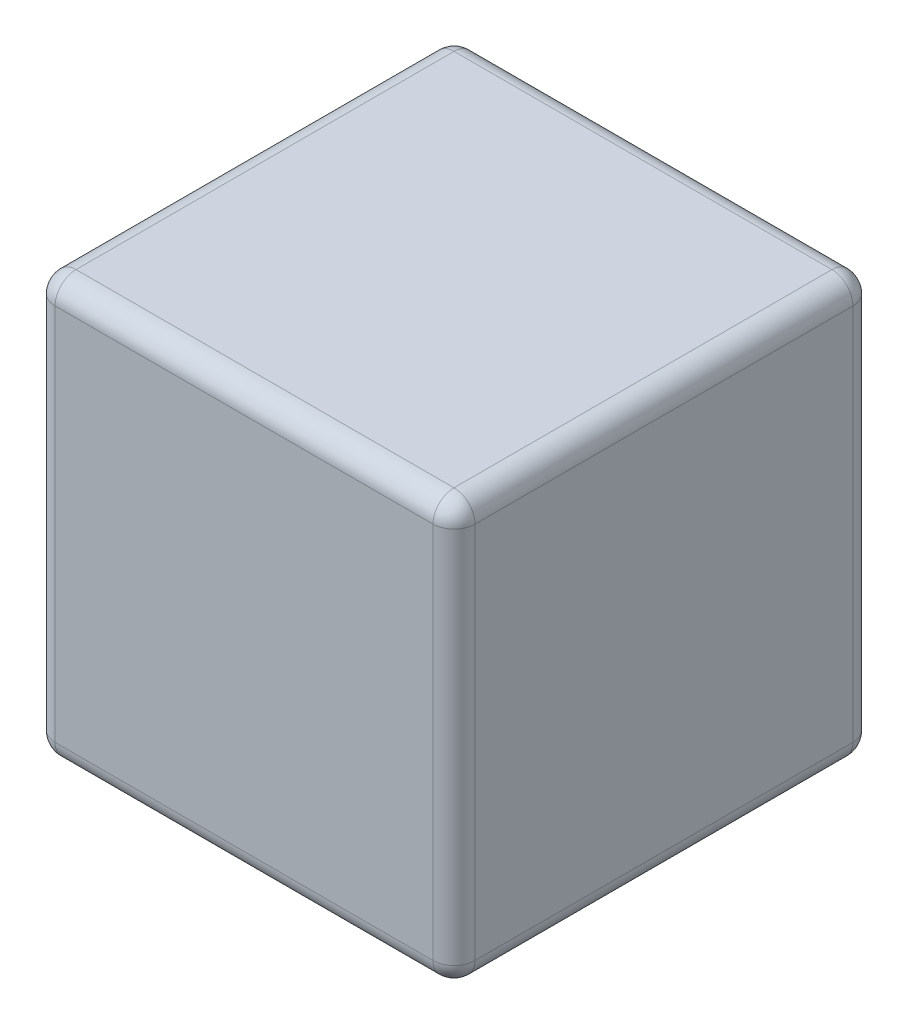
ISO-10303-21;
HEADER;
FILE_DESCRIPTION(('STEP AP214'),'2;1');
FILE_NAME('part.step','',(''),(''),'','','');
FILE_SCHEMA(('AUTOMOTIVE_DESIGN { 1 0 10303 214 1 1 1 1 }'));
ENDSEC;
DATA;
#1=APPLICATION_CONTEXT('core data for automotive mechanical design processes');
#2=APPLICATION_PROTOCOL_DEFINITION('international standard','automotive_design',2000,#1);
#3=PRODUCT_CONTEXT('',#1,'mechanical');
#4=PRODUCT('Part','Part','',(#3));
#5=PRODUCT_RELATED_PRODUCT_CATEGORY('part','',(#4));
#6=PRODUCT_DEFINITION_FORMATION('','',#4);
#7=PRODUCT_DEFINITION_CONTEXT('part definition',#1,'design');
#8=PRODUCT_DEFINITION('design','',#6,#7);
#9=PRODUCT_DEFINITION_SHAPE('','',#8);
#10=(LENGTH_UNIT() NAMED_UNIT(*) SI_UNIT(.MILLI.,.METRE.));
#11=(NAMED_UNIT(*) PLANE_ANGLE_UNIT() SI_UNIT($,.RADIAN.));
#12=(NAMED_UNIT(*) SI_UNIT($,.STERADIAN.) SOLID_ANGLE_UNIT());
#13=UNCERTAINTY_MEASURE_WITH_UNIT(LENGTH_MEASURE(1.E-05),#10,'distance_accuracy_value','');
#14=(GEOMETRIC_REPRESENTATION_CONTEXT(3) GLOBAL_UNCERTAINTY_ASSIGNED_CONTEXT((#13)) GLOBAL_UNIT_ASSIGNED_CONTEXT((#10,
#11,#12)) REPRESENTATION_CONTEXT('',''));
#15=CARTESIAN_POINT('',(0.,0.,0.));
#16=DIRECTION('',(0.,0.,1.));
#17=DIRECTION('',(1.,0.,0.));
#18=AXIS2_PLACEMENT_3D('',#15,#16,#17);
#19=CARTESIAN_POINT('',(20.,20.,40.));
#20=DIRECTION('',(-1.,0.,0.));
#21=DIRECTION('',(0.,-1.,0.));
#22=AXIS2_PLACEMENT_3D('',#19,#20,#21);
#23=PLANE('',#22);
#24=DIRECTION('',(0.,0.,-1.));
#25=VECTOR('',#24,1.);
#26=CARTESIAN_POINT('',(20.,18.,40.));
#27=LINE('',#26,#25);
#28=CARTESIAN_POINT('',(20.,18.,2.));
#29=VERTEX_POINT('',#28);
#30=CARTESIAN_POINT('',(20.,18.,38.));
#31=VERTEX_POINT('',#30);
#32=EDGE_CURVE('E147',#29,#31,#27,.F.);
#33=ORIENTED_EDGE('',*,*,#32,.T.);
#34=DIRECTION('',(0.,1.,0.));
#35=VECTOR('',#34,1.);
#36=CARTESIAN_POINT('',(20.,-20.,38.));
#37=LINE('',#36,#35);
#38=CARTESIAN_POINT('',(20.,-18.,38.));
#39=VERTEX_POINT('',#38);
#40=EDGE_CURVE('E150',#31,#39,#37,.F.);
#41=ORIENTED_EDGE('',*,*,#40,.T.);
#42=DIRECTION('',(0.,0.,-1.));
#43=VECTOR('',#42,1.);
#44=CARTESIAN_POINT('',(20.,-18.,40.));
#45=LINE('',#44,#43);
#46=CARTESIAN_POINT('',(20.,-18.,2.));
#47=VERTEX_POINT('',#46);
#48=EDGE_CURVE('E124',#39,#47,#45,.T.);
#49=ORIENTED_EDGE('',*,*,#48,.T.);
#50=DIRECTION('',(0.,1.,0.));
#51=VECTOR('',#50,1.);
#52=CARTESIAN_POINT('',(20.,20.,2.));
#53=LINE('',#52,#51);
#54=EDGE_CURVE('E141',#47,#29,#53,.T.);
#55=ORIENTED_EDGE('',*,*,#54,.T.);
#56=EDGE_LOOP('',(#33,#41,#49,#55));
#57=FACE_BOUND('',#56,.T.);
#58=ADVANCED_FACE('F31',(#57),#23,.F.);
#59=CARTESIAN_POINT('',(-20.,20.,40.));
#60=DIRECTION('',(0.,-1.,0.));
#61=DIRECTION('',(0.,0.,-1.));
#62=AXIS2_PLACEMENT_3D('',#59,#60,#61);
#63=PLANE('',#62);
#64=DIRECTION('',(-1.,0.,0.));
#65=VECTOR('',#64,1.);
#66=CARTESIAN_POINT('',(20.,20.,38.));
#67=LINE('',#66,#65);
#68=CARTESIAN_POINT('',(-18.,20.,38.));
#69=VERTEX_POINT('',#68);
#70=CARTESIAN_POINT('',(18.,20.,38.));
#71=VERTEX_POINT('',#70);
#72=EDGE_CURVE('E167',#69,#71,#67,.F.);
#73=ORIENTED_EDGE('',*,*,#72,.T.);
#74=DIRECTION('',(0.,0.,-1.));
#75=VECTOR('',#74,1.);
#76=CARTESIAN_POINT('',(18.,20.,40.));
#77=LINE('',#76,#75);
#78=CARTESIAN_POINT('',(18.,20.,2.));
#79=VERTEX_POINT('',#78);
#80=EDGE_CURVE('E169',#71,#79,#77,.T.);
#81=ORIENTED_EDGE('',*,*,#80,.T.);
#82=DIRECTION('',(-1.,0.,0.));
#83=VECTOR('',#82,1.);
#84=CARTESIAN_POINT('',(-20.,20.,2.));
#85=LINE('',#84,#83);
#86=CARTESIAN_POINT('',(-18.,20.,2.));
#87=VERTEX_POINT('',#86);
#88=EDGE_CURVE('E163',#79,#87,#85,.T.);
#89=ORIENTED_EDGE('',*,*,#88,.T.);
#90=DIRECTION('',(0.,0.,-1.));
#91=VECTOR('',#90,1.);
#92=CARTESIAN_POINT('',(-18.,20.,40.));
#93=LINE('',#92,#91);
#94=EDGE_CURVE('E165',#87,#69,#93,.F.);
#95=ORIENTED_EDGE('',*,*,#94,.T.);
#96=EDGE_LOOP('',(#73,#81,#89,#95));
#97=FACE_BOUND('',#96,.T.);
#98=ADVANCED_FACE('F276',(#97),#63,.F.);
#99=CARTESIAN_POINT('',(-20.,20.,40.));
#100=DIRECTION('',(1.,0.,0.));
#101=DIRECTION('',(0.,1.,0.));
#102=AXIS2_PLACEMENT_3D('',#99,#100,#101);
#103=PLANE('',#102);
#104=DIRECTION('',(0.,-1.,0.));
#105=VECTOR('',#104,1.);
#106=CARTESIAN_POINT('',(-20.,20.,38.));
#107=LINE('',#106,#105);
#108=CARTESIAN_POINT('',(-20.,-18.,38.));
#109=VERTEX_POINT('',#108);
#110=CARTESIAN_POINT('',(-20.,18.,38.));
#111=VERTEX_POINT('',#110);
#112=EDGE_CURVE('E185',#109,#111,#107,.F.);
#113=ORIENTED_EDGE('',*,*,#112,.T.);
#114=DIRECTION('',(0.,0.,-1.));
#115=VECTOR('',#114,1.);
#116=CARTESIAN_POINT('',(-20.,18.,40.));
#117=LINE('',#116,#115);
#118=CARTESIAN_POINT('',(-20.,18.,2.));
#119=VERTEX_POINT('',#118);
#120=EDGE_CURVE('E187',#111,#119,#117,.T.);
#121=ORIENTED_EDGE('',*,*,#120,.T.);
#122=DIRECTION('',(0.,-1.,0.));
#123=VECTOR('',#122,1.);
#124=CARTESIAN_POINT('',(-20.,20.,2.));
#125=LINE('',#124,#123);
#126=CARTESIAN_POINT('',(-20.,-18.,2.));
#127=VERTEX_POINT('',#126);
#128=EDGE_CURVE('E181',#119,#127,#125,.T.);
#129=ORIENTED_EDGE('',*,*,#128,.T.);
#130=DIRECTION('',(0.,0.,-1.));
#131=VECTOR('',#130,1.);
#132=CARTESIAN_POINT('',(-20.,-18.,40.));
#133=LINE('',#132,#131);
#134=EDGE_CURVE('E183',#127,#109,#133,.F.);
#135=ORIENTED_EDGE('',*,*,#134,.T.);
#136=EDGE_LOOP('',(#113,#121,#129,#135));
#137=FACE_BOUND('',#136,.T.);
#138=ADVANCED_FACE('F289',(#137),#103,.F.);
#139=CARTESIAN_POINT('',(-20.,-20.,40.));
#140=DIRECTION('',(0.,1.,0.));
#141=DIRECTION('',(0.,0.,1.));
#142=AXIS2_PLACEMENT_3D('',#139,#140,#141);
#143=PLANE('',#142);
#144=DIRECTION('',(1.,0.,0.));
#145=VECTOR('',#144,1.);
#146=CARTESIAN_POINT('',(-20.,-20.,2.));
#147=LINE('',#146,#145);
#148=CARTESIAN_POINT('',(-18.,-20.,2.));
#149=VERTEX_POINT('',#148);
#150=CARTESIAN_POINT('',(18.,-20.,2.));
#151=VERTEX_POINT('',#150);
#152=EDGE_CURVE('E153',#149,#151,#147,.T.);
#153=ORIENTED_EDGE('',*,*,#152,.T.);
#154=DIRECTION('',(0.,0.,-1.));
#155=VECTOR('',#154,1.);
#156=CARTESIAN_POINT('',(18.,-20.,40.));
#157=LINE('',#156,#155);
#158=CARTESIAN_POINT('',(18.,-20.,38.));
#159=VERTEX_POINT('',#158);
#160=EDGE_CURVE('E126',#151,#159,#157,.F.);
#161=ORIENTED_EDGE('',*,*,#160,.T.);
#162=DIRECTION('',(1.,0.,0.));
#163=VECTOR('',#162,1.);
#164=CARTESIAN_POINT('',(-20.,-20.,38.));
#165=LINE('',#164,#163);
#166=CARTESIAN_POINT('',(-18.,-20.,38.));
#167=VERTEX_POINT('',#166);
#168=EDGE_CURVE('E160',#159,#167,#165,.F.);
#169=ORIENTED_EDGE('',*,*,#168,.T.);
#170=DIRECTION('',(0.,0.,-1.));
#171=VECTOR('',#170,1.);
#172=CARTESIAN_POINT('',(-18.,-20.,40.));
#173=LINE('',#172,#171);
#174=EDGE_CURVE('E158',#167,#149,#173,.T.);
#175=ORIENTED_EDGE('',*,*,#174,.T.);
#176=EDGE_LOOP('',(#153,#161,#169,#175));
#177=FACE_BOUND('',#176,.T.);
#178=ADVANCED_FACE('F305',(#177),#143,.F.);
#179=CARTESIAN_POINT('',(20.,-20.,40.));
#180=DIRECTION('',(0.,0.,1.));
#181=DIRECTION('',(1.,0.,0.));
#182=AXIS2_PLACEMENT_3D('',#179,#180,#181);
#183=PLANE('',#182);
#184=DIRECTION('',(1.,0.,0.));
#185=VECTOR('',#184,1.);
#186=CARTESIAN_POINT('',(20.,-18.,40.));
#187=LINE('',#186,#185);
#188=CARTESIAN_POINT('',(-18.,-18.,40.));
#189=VERTEX_POINT('',#188);
#190=CARTESIAN_POINT('',(18.,-18.,40.));
#191=VERTEX_POINT('',#190);
#192=EDGE_CURVE('E176',#189,#191,#187,.T.);
#193=ORIENTED_EDGE('',*,*,#192,.T.);
#194=DIRECTION('',(0.,1.,0.));
#195=VECTOR('',#194,1.);
#196=CARTESIAN_POINT('',(18.,20.,40.));
#197=LINE('',#196,#195);
#198=CARTESIAN_POINT('',(18.,18.,40.));
#199=VERTEX_POINT('',#198);
#200=EDGE_CURVE('E179',#191,#199,#197,.T.);
#201=ORIENTED_EDGE('',*,*,#200,.T.);
#202=DIRECTION('',(-1.,0.,0.));
#203=VECTOR('',#202,1.);
#204=CARTESIAN_POINT('',(-20.,18.,40.));
#205=LINE('',#204,#203);
#206=CARTESIAN_POINT('',(-18.,18.,40.));
#207=VERTEX_POINT('',#206);
#208=EDGE_CURVE('E174',#199,#207,#205,.T.);
#209=ORIENTED_EDGE('',*,*,#208,.T.);
#210=DIRECTION('',(0.,-1.,0.));
#211=VECTOR('',#210,1.);
#212=CARTESIAN_POINT('',(-18.,-20.,40.));
#213=LINE('',#212,#211);
#214=EDGE_CURVE('E172',#207,#189,#213,.T.);
#215=ORIENTED_EDGE('',*,*,#214,.T.);
#216=EDGE_LOOP('',(#193,#201,#209,#215));
#217=FACE_BOUND('',#216,.T.);
#218=ADVANCED_FACE('F267',(#217),#183,.T.);
#219=CARTESIAN_POINT('',(20.,-20.,0.));
#220=DIRECTION('',(0.,0.,1.));
#221=DIRECTION('',(1.,0.,0.));
#222=AXIS2_PLACEMENT_3D('',#219,#220,#221);
#223=PLANE('',#222);
#224=DIRECTION('',(0.,-1.,0.));
#225=VECTOR('',#224,1.);
#226=CARTESIAN_POINT('',(-18.,-20.,0.));
#227=LINE('',#226,#225);
#228=CARTESIAN_POINT('',(-18.,-18.,0.));
#229=VERTEX_POINT('',#228);
#230=CARTESIAN_POINT('',(-18.,18.,0.));
#231=VERTEX_POINT('',#230);
#232=EDGE_CURVE('E40',#229,#231,#227,.F.);
#233=ORIENTED_EDGE('',*,*,#232,.T.);
#234=DIRECTION('',(-1.,0.,0.));
#235=VECTOR('',#234,1.);
#236=CARTESIAN_POINT('',(20.,18.,0.));
#237=LINE('',#236,#235);
#238=CARTESIAN_POINT('',(18.,18.,0.));
#239=VERTEX_POINT('',#238);
#240=EDGE_CURVE('E11',#231,#239,#237,.F.);
#241=ORIENTED_EDGE('',*,*,#240,.T.);
#242=DIRECTION('',(0.,1.,0.));
#243=VECTOR('',#242,1.);
#244=CARTESIAN_POINT('',(18.,-20.,0.));
#245=LINE('',#244,#243);
#246=CARTESIAN_POINT('',(18.,-18.,0.));
#247=VERTEX_POINT('',#246);
#248=EDGE_CURVE('E190',#239,#247,#245,.F.);
#249=ORIENTED_EDGE('',*,*,#248,.T.);
#250=DIRECTION('',(1.,0.,0.));
#251=VECTOR('',#250,1.);
#252=CARTESIAN_POINT('',(20.,-18.,0.));
#253=LINE('',#252,#251);
#254=EDGE_CURVE('E51',#247,#229,#253,.F.);
#255=ORIENTED_EDGE('',*,*,#254,.T.);
#256=EDGE_LOOP('',(#233,#241,#249,#255));
#257=FACE_BOUND('',#256,.T.);
#258=ADVANCED_FACE('F476',(#257),#223,.F.);
#259=CARTESIAN_POINT('',(-18.,18.,40.));
#260=DIRECTION('',(0.,0.,-1.));
#261=DIRECTION('',(-1.,0.,0.));
#262=AXIS2_PLACEMENT_3D('',#259,#260,#261);
#263=CYLINDRICAL_SURFACE('',#262,2.);
#264=CARTESIAN_POINT('',(-18.,18.,38.));
#265=DIRECTION('',(0.,0.,1.));
#266=DIRECTION('',(1.,0.,0.));
#267=AXIS2_PLACEMENT_3D('',#264,#265,#266);
#268=CIRCLE('',#267,2.);
#269=EDGE_CURVE('E35',#69,#111,#268,.T.);
#270=ORIENTED_EDGE('',*,*,#269,.F.);
#271=ORIENTED_EDGE('',*,*,#94,.F.);
#272=CARTESIAN_POINT('',(-18.,18.,2.));
#273=DIRECTION('',(0.,0.,-1.));
#274=DIRECTION('',(-1.,0.,0.));
#275=AXIS2_PLACEMENT_3D('',#272,#273,#274);
#276=CIRCLE('',#275,2.);
#277=EDGE_CURVE('E243',#119,#87,#276,.T.);
#278=ORIENTED_EDGE('',*,*,#277,.F.);
#279=ORIENTED_EDGE('',*,*,#120,.F.);
#280=EDGE_LOOP('',(#270,#271,#278,#279));
#281=FACE_BOUND('',#280,.T.);
#282=ADVANCED_FACE('F33',(#281),#263,.T.);
#283=CARTESIAN_POINT('',(-18.,18.,38.));
#284=DIRECTION('',(0.,0.,1.));
#285=DIRECTION('',(1.,0.,0.));
#286=AXIS2_PLACEMENT_3D('',#283,#284,#285);
#287=SPHERICAL_SURFACE('',#286,2.);
#288=CARTESIAN_POINT('',(-18.,18.,38.));
#289=DIRECTION('',(-1.,0.,0.));
#290=DIRECTION('',(0.,-1.,0.));
#291=AXIS2_PLACEMENT_3D('',#288,#289,#290);
#292=CIRCLE('',#291,2.);
#293=EDGE_CURVE('E238',#69,#207,#292,.F.);
#294=ORIENTED_EDGE('',*,*,#293,.F.);
#295=ORIENTED_EDGE('',*,*,#269,.T.);
#296=CARTESIAN_POINT('',(-18.,18.,38.));
#297=DIRECTION('',(0.,1.,0.));
#298=DIRECTION('',(0.,0.,1.));
#299=AXIS2_PLACEMENT_3D('',#296,#297,#298);
#300=CIRCLE('',#299,2.);
#301=EDGE_CURVE('E241',#207,#111,#300,.F.);
#302=ORIENTED_EDGE('',*,*,#301,.F.);
#303=EDGE_LOOP('',(#294,#295,#302));
#304=FACE_BOUND('',#303,.T.);
#305=ADVANCED_FACE('F254',(#304),#287,.T.);
#306=CARTESIAN_POINT('',(-18.,18.,2.));
#307=DIRECTION('',(0.,0.,1.));
#308=DIRECTION('',(1.,0.,0.));
#309=AXIS2_PLACEMENT_3D('',#306,#307,#308);
#310=SPHERICAL_SURFACE('',#309,2.);
#311=CARTESIAN_POINT('',(-18.,18.,2.));
#312=DIRECTION('',(0.,1.,0.));
#313=DIRECTION('',(0.,0.,1.));
#314=AXIS2_PLACEMENT_3D('',#311,#312,#313);
#315=CIRCLE('',#314,2.);
#316=EDGE_CURVE('E233',#119,#231,#315,.F.);
#317=ORIENTED_EDGE('',*,*,#316,.F.);
#318=ORIENTED_EDGE('',*,*,#277,.T.);
#319=CARTESIAN_POINT('',(-18.,18.,2.));
#320=DIRECTION('',(-1.,0.,0.));
#321=DIRECTION('',(0.,0.,1.));
#322=AXIS2_PLACEMENT_3D('',#319,#320,#321);
#323=CIRCLE('',#322,2.);
#324=EDGE_CURVE('E235',#231,#87,#323,.F.);
#325=ORIENTED_EDGE('',*,*,#324,.F.);
#326=EDGE_LOOP('',(#317,#318,#325));
#327=FACE_BOUND('',#326,.T.);
#328=ADVANCED_FACE('F455',(#327),#310,.T.);
#329=CARTESIAN_POINT('',(-18.,-20.,38.));
#330=DIRECTION('',(0.,1.,0.));
#331=DIRECTION('',(-1.,0.,0.));
#332=AXIS2_PLACEMENT_3D('',#329,#330,#331);
#333=CYLINDRICAL_SURFACE('',#332,2.);
#334=ORIENTED_EDGE('',*,*,#301,.T.);
#335=ORIENTED_EDGE('',*,*,#112,.F.);
#336=CARTESIAN_POINT('',(-18.,-18.,38.));
#337=DIRECTION('',(0.,-1.,0.));
#338=DIRECTION('',(0.,0.,-1.));
#339=AXIS2_PLACEMENT_3D('',#336,#337,#338);
#340=CIRCLE('',#339,2.);
#341=EDGE_CURVE('E227',#189,#109,#340,.T.);
#342=ORIENTED_EDGE('',*,*,#341,.F.);
#343=ORIENTED_EDGE('',*,*,#214,.F.);
#344=EDGE_LOOP('',(#334,#335,#342,#343));
#345=FACE_BOUND('',#344,.T.);
#346=ADVANCED_FACE('F262',(#345),#333,.T.);
#347=CARTESIAN_POINT('',(20.,18.,38.));
#348=DIRECTION('',(1.,0.,0.));
#349=DIRECTION('',(0.,0.,-1.));
#350=AXIS2_PLACEMENT_3D('',#347,#348,#349);
#351=CYLINDRICAL_SURFACE('',#350,2.);
#352=ORIENTED_EDGE('',*,*,#293,.T.);
#353=ORIENTED_EDGE('',*,*,#208,.F.);
#354=CARTESIAN_POINT('',(18.,18.,38.));
#355=DIRECTION('',(1.,0.,0.));
#356=DIRECTION('',(0.,0.,-1.));
#357=AXIS2_PLACEMENT_3D('',#354,#355,#356);
#358=CIRCLE('',#357,2.);
#359=EDGE_CURVE('E224',#71,#199,#358,.T.);
#360=ORIENTED_EDGE('',*,*,#359,.F.);
#361=ORIENTED_EDGE('',*,*,#72,.F.);
#362=EDGE_LOOP('',(#352,#353,#360,#361));
#363=FACE_BOUND('',#362,.T.);
#364=ADVANCED_FACE('F273',(#363),#351,.T.);
#365=CARTESIAN_POINT('',(18.,18.,40.));
#366=DIRECTION('',(0.,0.,-1.));
#367=DIRECTION('',(-1.,0.,0.));
#368=AXIS2_PLACEMENT_3D('',#365,#366,#367);
#369=CYLINDRICAL_SURFACE('',#368,2.);
#370=CARTESIAN_POINT('',(18.,18.,2.));
#371=DIRECTION('',(0.,0.,-1.));
#372=DIRECTION('',(-1.,0.,0.));
#373=AXIS2_PLACEMENT_3D('',#370,#371,#372);
#374=CIRCLE('',#373,2.);
#375=EDGE_CURVE('E218',#79,#29,#374,.T.);
#376=ORIENTED_EDGE('',*,*,#375,.F.);
#377=ORIENTED_EDGE('',*,*,#80,.F.);
#378=CARTESIAN_POINT('',(18.,18.,38.));
#379=DIRECTION('',(0.,0.,1.));
#380=DIRECTION('',(1.,0.,0.));
#381=AXIS2_PLACEMENT_3D('',#378,#379,#380);
#382=CIRCLE('',#381,2.);
#383=EDGE_CURVE('E221',#31,#71,#382,.T.);
#384=ORIENTED_EDGE('',*,*,#383,.F.);
#385=ORIENTED_EDGE('',*,*,#32,.F.);
#386=EDGE_LOOP('',(#376,#377,#384,#385));
#387=FACE_BOUND('',#386,.T.);
#388=ADVANCED_FACE('F280',(#387),#369,.T.);
#389=CARTESIAN_POINT('',(-20.,18.,2.));
#390=DIRECTION('',(-1.,0.,0.));
#391=DIRECTION('',(0.,0.,1.));
#392=AXIS2_PLACEMENT_3D('',#389,#390,#391);
#393=CYLINDRICAL_SURFACE('',#392,2.);
#394=ORIENTED_EDGE('',*,*,#324,.T.);
#395=ORIENTED_EDGE('',*,*,#88,.F.);
#396=CARTESIAN_POINT('',(18.,18.,2.));
#397=DIRECTION('',(1.,0.,0.));
#398=DIRECTION('',(0.,1.,0.));
#399=AXIS2_PLACEMENT_3D('',#396,#397,#398);
#400=CIRCLE('',#399,2.);
#401=EDGE_CURVE('E216',#239,#79,#400,.T.);
#402=ORIENTED_EDGE('',*,*,#401,.F.);
#403=ORIENTED_EDGE('',*,*,#240,.F.);
#404=EDGE_LOOP('',(#394,#395,#402,#403));
#405=FACE_BOUND('',#404,.T.);
#406=ADVANCED_FACE('F286',(#405),#393,.T.);
#407=CARTESIAN_POINT('',(-18.,20.,2.));
#408=DIRECTION('',(0.,-1.,0.));
#409=DIRECTION('',(1.,0.,0.));
#410=AXIS2_PLACEMENT_3D('',#407,#408,#409);
#411=CYLINDRICAL_SURFACE('',#410,2.);
#412=ORIENTED_EDGE('',*,*,#316,.T.);
#413=ORIENTED_EDGE('',*,*,#232,.F.);
#414=CARTESIAN_POINT('',(-18.,-18.,2.));
#415=DIRECTION('',(0.,-1.,0.));
#416=DIRECTION('',(0.,0.,-1.));
#417=AXIS2_PLACEMENT_3D('',#414,#415,#416);
#418=CIRCLE('',#417,2.);
#419=EDGE_CURVE('E213',#127,#229,#418,.T.);
#420=ORIENTED_EDGE('',*,*,#419,.F.);
#421=ORIENTED_EDGE('',*,*,#128,.F.);
#422=EDGE_LOOP('',(#412,#413,#420,#421));
#423=FACE_BOUND('',#422,.T.);
#424=ADVANCED_FACE('F298',(#423),#411,.T.);
#425=CARTESIAN_POINT('',(-18.,-18.,40.));
#426=DIRECTION('',(0.,0.,-1.));
#427=DIRECTION('',(-1.,0.,0.));
#428=AXIS2_PLACEMENT_3D('',#425,#426,#427);
#429=CYLINDRICAL_SURFACE('',#428,2.);
#430=CARTESIAN_POINT('',(-18.,-18.,38.));
#431=DIRECTION('',(0.,0.,1.));
#432=DIRECTION('',(1.,0.,0.));
#433=AXIS2_PLACEMENT_3D('',#430,#431,#432);
#434=CIRCLE('',#433,2.);
#435=EDGE_CURVE('E230',#109,#167,#434,.T.);
#436=ORIENTED_EDGE('',*,*,#435,.F.);
#437=ORIENTED_EDGE('',*,*,#134,.F.);
#438=CARTESIAN_POINT('',(-18.,-18.,2.));
#439=DIRECTION('',(0.,0.,-1.));
#440=DIRECTION('',(-1.,0.,0.));
#441=AXIS2_PLACEMENT_3D('',#438,#439,#440);
#442=CIRCLE('',#441,2.);
#443=EDGE_CURVE('E210',#149,#127,#442,.T.);
#444=ORIENTED_EDGE('',*,*,#443,.F.);
#445=ORIENTED_EDGE('',*,*,#174,.F.);
#446=EDGE_LOOP('',(#436,#437,#444,#445));
#447=FACE_BOUND('',#446,.T.);
#448=ADVANCED_FACE('F294',(#447),#429,.T.);
#449=CARTESIAN_POINT('',(-18.,-18.,38.));
#450=DIRECTION('',(0.,0.,1.));
#451=DIRECTION('',(1.,0.,0.));
#452=AXIS2_PLACEMENT_3D('',#449,#450,#451);
#453=SPHERICAL_SURFACE('',#452,2.);
#454=ORIENTED_EDGE('',*,*,#341,.T.);
#455=ORIENTED_EDGE('',*,*,#435,.T.);
#456=CARTESIAN_POINT('',(-18.,-18.,38.));
#457=DIRECTION('',(-1.,0.,0.));
#458=DIRECTION('',(0.,0.,1.));
#459=AXIS2_PLACEMENT_3D('',#456,#457,#458);
#460=CIRCLE('',#459,2.);
#461=EDGE_CURVE('E207',#189,#167,#460,.F.);
#462=ORIENTED_EDGE('',*,*,#461,.F.);
#463=EDGE_LOOP('',(#454,#455,#462));
#464=FACE_BOUND('',#463,.T.);
#465=ADVANCED_FACE('F308',(#464),#453,.T.);
#466=CARTESIAN_POINT('',(18.,18.,38.));
#467=DIRECTION('',(0.,0.,1.));
#468=DIRECTION('',(1.,0.,0.));
#469=AXIS2_PLACEMENT_3D('',#466,#467,#468);
#470=SPHERICAL_SURFACE('',#469,2.);
#471=ORIENTED_EDGE('',*,*,#383,.T.);
#472=ORIENTED_EDGE('',*,*,#359,.T.);
#473=CARTESIAN_POINT('',(18.,18.,38.));
#474=DIRECTION('',(0.,1.,0.));
#475=DIRECTION('',(-1.,0.,0.));
#476=AXIS2_PLACEMENT_3D('',#473,#474,#475);
#477=CIRCLE('',#476,2.);
#478=EDGE_CURVE('E204',#31,#199,#477,.F.);
#479=ORIENTED_EDGE('',*,*,#478,.F.);
#480=EDGE_LOOP('',(#471,#472,#479));
#481=FACE_BOUND('',#480,.T.);
#482=ADVANCED_FACE('F317',(#481),#470,.T.);
#483=CARTESIAN_POINT('',(18.,18.,2.));
#484=DIRECTION('',(0.,0.,1.));
#485=DIRECTION('',(1.,0.,0.));
#486=AXIS2_PLACEMENT_3D('',#483,#484,#485);
#487=SPHERICAL_SURFACE('',#486,2.);
#488=ORIENTED_EDGE('',*,*,#401,.T.);
#489=ORIENTED_EDGE('',*,*,#375,.T.);
#490=CARTESIAN_POINT('',(18.,18.,2.));
#491=DIRECTION('',(0.,1.,0.));
#492=DIRECTION('',(0.,0.,1.));
#493=AXIS2_PLACEMENT_3D('',#490,#491,#492);
#494=CIRCLE('',#493,2.);
#495=EDGE_CURVE('E144',#239,#29,#494,.F.);
#496=ORIENTED_EDGE('',*,*,#495,.F.);
#497=EDGE_LOOP('',(#488,#489,#496));
#498=FACE_BOUND('',#497,.T.);
#499=ADVANCED_FACE('F319',(#498),#487,.T.);
#500=CARTESIAN_POINT('',(-18.,-18.,2.));
#501=DIRECTION('',(0.,0.,1.));
#502=DIRECTION('',(1.,0.,0.));
#503=AXIS2_PLACEMENT_3D('',#500,#501,#502);
#504=SPHERICAL_SURFACE('',#503,2.);
#505=ORIENTED_EDGE('',*,*,#443,.T.);
#506=ORIENTED_EDGE('',*,*,#419,.T.);
#507=CARTESIAN_POINT('',(-18.,-18.,2.));
#508=DIRECTION('',(-1.,0.,0.));
#509=DIRECTION('',(0.,0.,1.));
#510=AXIS2_PLACEMENT_3D('',#507,#508,#509);
#511=CIRCLE('',#510,2.);
#512=EDGE_CURVE('E200',#149,#229,#511,.F.);
#513=ORIENTED_EDGE('',*,*,#512,.F.);
#514=EDGE_LOOP('',(#505,#506,#513));
#515=FACE_BOUND('',#514,.T.);
#516=ADVANCED_FACE('F300',(#515),#504,.T.);
#517=CARTESIAN_POINT('',(20.,-18.,38.));
#518=DIRECTION('',(-1.,0.,0.));
#519=DIRECTION('',(0.,0.,1.));
#520=AXIS2_PLACEMENT_3D('',#517,#518,#519);
#521=CYLINDRICAL_SURFACE('',#520,2.);
#522=ORIENTED_EDGE('',*,*,#461,.T.);
#523=ORIENTED_EDGE('',*,*,#168,.F.);
#524=CARTESIAN_POINT('',(18.,-18.,38.));
#525=DIRECTION('',(1.,0.,0.));
#526=DIRECTION('',(0.,0.,-1.));
#527=AXIS2_PLACEMENT_3D('',#524,#525,#526);
#528=CIRCLE('',#527,2.);
#529=EDGE_CURVE('E197',#191,#159,#528,.T.);
#530=ORIENTED_EDGE('',*,*,#529,.F.);
#531=ORIENTED_EDGE('',*,*,#192,.F.);
#532=EDGE_LOOP('',(#522,#523,#530,#531));
#533=FACE_BOUND('',#532,.T.);
#534=ADVANCED_FACE('F310',(#533),#521,.T.);
#535=CARTESIAN_POINT('',(18.,-20.,38.));
#536=DIRECTION('',(0.,-1.,0.));
#537=DIRECTION('',(1.,0.,0.));
#538=AXIS2_PLACEMENT_3D('',#535,#536,#537);
#539=CYLINDRICAL_SURFACE('',#538,2.);
#540=ORIENTED_EDGE('',*,*,#478,.T.);
#541=ORIENTED_EDGE('',*,*,#200,.F.);
#542=CARTESIAN_POINT('',(18.,-18.,38.));
#543=DIRECTION('',(0.,-1.,0.));
#544=DIRECTION('',(0.,0.,-1.));
#545=AXIS2_PLACEMENT_3D('',#542,#543,#544);
#546=CIRCLE('',#545,2.);
#547=EDGE_CURVE('E138',#39,#191,#546,.T.);
#548=ORIENTED_EDGE('',*,*,#547,.F.);
#549=ORIENTED_EDGE('',*,*,#40,.F.);
#550=EDGE_LOOP('',(#540,#541,#548,#549));
#551=FACE_BOUND('',#550,.T.);
#552=ADVANCED_FACE('F315',(#551),#539,.T.);
#553=CARTESIAN_POINT('',(18.,20.,2.));
#554=DIRECTION('',(0.,1.,0.));
#555=DIRECTION('',(-1.,0.,0.));
#556=AXIS2_PLACEMENT_3D('',#553,#554,#555);
#557=CYLINDRICAL_SURFACE('',#556,2.);
#558=ORIENTED_EDGE('',*,*,#495,.T.);
#559=ORIENTED_EDGE('',*,*,#54,.F.);
#560=CARTESIAN_POINT('',(18.,-18.,2.));
#561=DIRECTION('',(0.,-1.,0.));
#562=DIRECTION('',(1.,0.,0.));
#563=AXIS2_PLACEMENT_3D('',#560,#561,#562);
#564=CIRCLE('',#563,2.);
#565=EDGE_CURVE('E132',#247,#47,#564,.T.);
#566=ORIENTED_EDGE('',*,*,#565,.F.);
#567=ORIENTED_EDGE('',*,*,#248,.F.);
#568=EDGE_LOOP('',(#558,#559,#566,#567));
#569=FACE_BOUND('',#568,.T.);
#570=ADVANCED_FACE('F142',(#569),#557,.T.);
#571=CARTESIAN_POINT('',(-20.,-18.,2.));
#572=DIRECTION('',(1.,0.,0.));
#573=DIRECTION('',(0.,0.,-1.));
#574=AXIS2_PLACEMENT_3D('',#571,#572,#573);
#575=CYLINDRICAL_SURFACE('',#574,2.);
#576=ORIENTED_EDGE('',*,*,#512,.T.);
#577=ORIENTED_EDGE('',*,*,#254,.F.);
#578=CARTESIAN_POINT('',(18.,-18.,2.));
#579=DIRECTION('',(1.,0.,0.));
#580=DIRECTION('',(0.,0.,-1.));
#581=AXIS2_PLACEMENT_3D('',#578,#579,#580);
#582=CIRCLE('',#581,2.);
#583=EDGE_CURVE('E136',#151,#247,#582,.T.);
#584=ORIENTED_EDGE('',*,*,#583,.F.);
#585=ORIENTED_EDGE('',*,*,#152,.F.);
#586=EDGE_LOOP('',(#576,#577,#584,#585));
#587=FACE_BOUND('',#586,.T.);
#588=ADVANCED_FACE('F303',(#587),#575,.T.);
#589=CARTESIAN_POINT('',(18.,-18.,38.));
#590=DIRECTION('',(0.,0.,1.));
#591=DIRECTION('',(1.,0.,0.));
#592=AXIS2_PLACEMENT_3D('',#589,#590,#591);
#593=SPHERICAL_SURFACE('',#592,2.);
#594=ORIENTED_EDGE('',*,*,#547,.T.);
#595=ORIENTED_EDGE('',*,*,#529,.T.);
#596=CARTESIAN_POINT('',(18.,-18.,38.));
#597=DIRECTION('',(0.,0.,1.));
#598=DIRECTION('',(1.,0.,0.));
#599=AXIS2_PLACEMENT_3D('',#596,#597,#598);
#600=CIRCLE('',#599,2.);
#601=EDGE_CURVE('E129',#39,#159,#600,.F.);
#602=ORIENTED_EDGE('',*,*,#601,.F.);
#603=EDGE_LOOP('',(#594,#595,#602));
#604=FACE_BOUND('',#603,.T.);
#605=ADVANCED_FACE('F339',(#604),#593,.T.);
#606=CARTESIAN_POINT('',(18.,-18.,2.));
#607=DIRECTION('',(0.,0.,1.));
#608=DIRECTION('',(1.,0.,0.));
#609=AXIS2_PLACEMENT_3D('',#606,#607,#608);
#610=SPHERICAL_SURFACE('',#609,2.);
#611=ORIENTED_EDGE('',*,*,#583,.T.);
#612=ORIENTED_EDGE('',*,*,#565,.T.);
#613=CARTESIAN_POINT('',(18.,-18.,2.));
#614=DIRECTION('',(0.,0.,-1.));
#615=DIRECTION('',(-1.,0.,0.));
#616=AXIS2_PLACEMENT_3D('',#613,#614,#615);
#617=CIRCLE('',#616,2.);
#618=EDGE_CURVE('E120',#151,#47,#617,.F.);
#619=ORIENTED_EDGE('',*,*,#618,.F.);
#620=EDGE_LOOP('',(#611,#612,#619));
#621=FACE_BOUND('',#620,.T.);
#622=ADVANCED_FACE('F134',(#621),#610,.T.);
#623=CARTESIAN_POINT('',(18.,-18.,40.));
#624=DIRECTION('',(0.,0.,-1.));
#625=DIRECTION('',(-1.,0.,0.));
#626=AXIS2_PLACEMENT_3D('',#623,#624,#625);
#627=CYLINDRICAL_SURFACE('',#626,2.);
#628=ORIENTED_EDGE('',*,*,#601,.T.);
#629=ORIENTED_EDGE('',*,*,#160,.F.);
#630=ORIENTED_EDGE('',*,*,#618,.T.);
#631=ORIENTED_EDGE('',*,*,#48,.F.);
#632=EDGE_LOOP('',(#628,#629,#630,#631));
#633=FACE_BOUND('',#632,.T.);
#634=ADVANCED_FACE('F122',(#633),#627,.T.);
#635=CLOSED_SHELL('',(#58,#98,#138,#178,#218,#258,#282,#305,#328,#346,#364,#388,#406,#424,#448,
#465,#482,#499,#516,#534,#552,#570,#588,#605,#622,#634));
#636=MANIFOLD_SOLID_BREP('B2',#635);
#637=ADVANCED_BREP_SHAPE_REPRESENTATION('',(#18,#636),#14);
#638=SHAPE_DEFINITION_REPRESENTATION(#9,#637);
ENDSEC;
END-ISO-10303-21;
